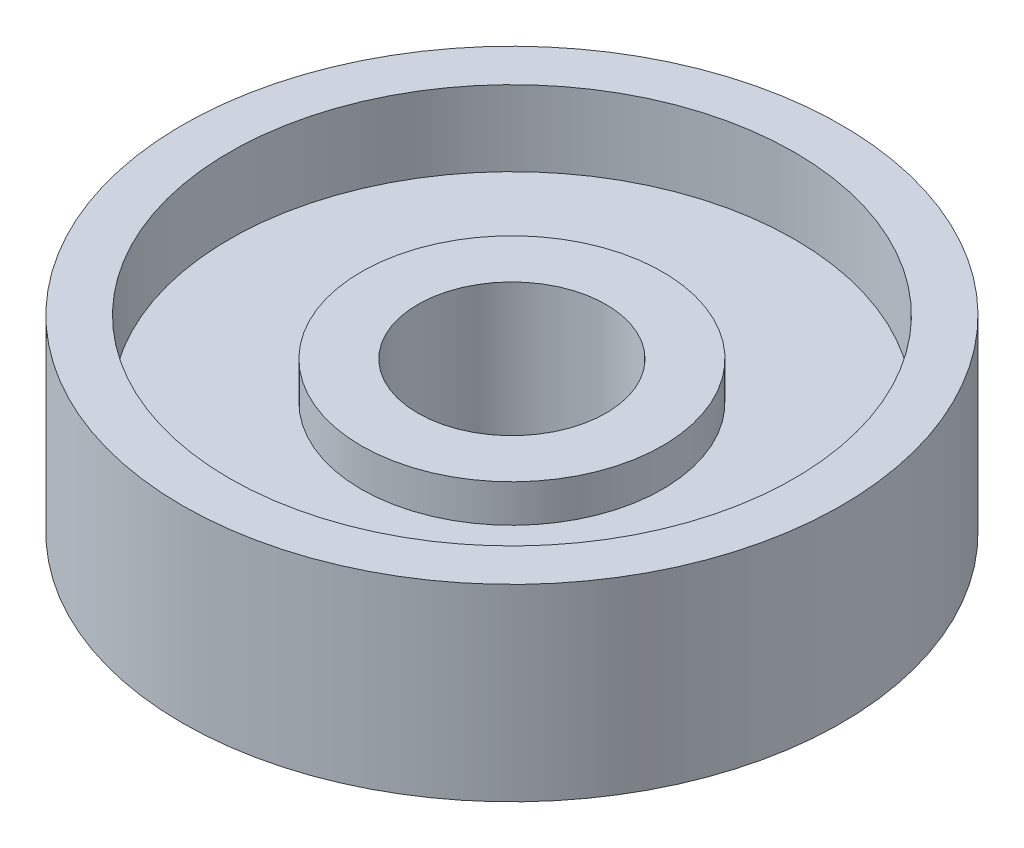
ISO-10303-21;
HEADER;
FILE_DESCRIPTION(('STEP AP214'),'2;1');
FILE_NAME('part.step','',(''),(''),'','','');
FILE_SCHEMA(('AUTOMOTIVE_DESIGN { 1 0 10303 214 1 1 1 1 }'));
ENDSEC;
DATA;
#1=APPLICATION_CONTEXT('core data for automotive mechanical design processes');
#2=APPLICATION_PROTOCOL_DEFINITION('international standard','automotive_design',2000,#1);
#3=PRODUCT_CONTEXT('',#1,'mechanical');
#4=PRODUCT('Part','Part','',(#3));
#5=PRODUCT_RELATED_PRODUCT_CATEGORY('part','',(#4));
#6=PRODUCT_DEFINITION_FORMATION('','',#4);
#7=PRODUCT_DEFINITION_CONTEXT('part definition',#1,'design');
#8=PRODUCT_DEFINITION('design','',#6,#7);
#9=PRODUCT_DEFINITION_SHAPE('','',#8);
#10=(LENGTH_UNIT() NAMED_UNIT(*) SI_UNIT(.MILLI.,.METRE.));
#11=(NAMED_UNIT(*) PLANE_ANGLE_UNIT() SI_UNIT($,.RADIAN.));
#12=(NAMED_UNIT(*) SI_UNIT($,.STERADIAN.) SOLID_ANGLE_UNIT());
#13=UNCERTAINTY_MEASURE_WITH_UNIT(LENGTH_MEASURE(1.E-05),#10,'distance_accuracy_value','');
#14=(GEOMETRIC_REPRESENTATION_CONTEXT(3) GLOBAL_UNCERTAINTY_ASSIGNED_CONTEXT((#13)) GLOBAL_UNIT_ASSIGNED_CONTEXT((#10,
#11,#12)) REPRESENTATION_CONTEXT('',''));
#15=CARTESIAN_POINT('',(0.,0.,0.));
#16=DIRECTION('',(0.,0.,1.));
#17=DIRECTION('',(1.,0.,0.));
#18=AXIS2_PLACEMENT_3D('',#15,#16,#17);
#19=CARTESIAN_POINT('',(0.,3.81,0.));
#20=DIRECTION('',(0.,1.,0.));
#21=DIRECTION('',(0.,0.,1.));
#22=AXIS2_PLACEMENT_3D('',#19,#20,#21);
#23=PLANE('',#22);
#24=CARTESIAN_POINT('',(0.,3.81,0.));
#25=DIRECTION('',(0.,1.,0.));
#26=DIRECTION('',(0.,0.,1.));
#27=AXIS2_PLACEMENT_3D('',#24,#25,#26);
#28=CIRCLE('',#27,9.525);
#29=CARTESIAN_POINT('',(0.,3.81,9.525));
#30=VERTEX_POINT('',#29);
#31=EDGE_CURVE('E57',#30,#30,#28,.T.);
#32=ORIENTED_EDGE('',*,*,#31,.T.);
#33=EDGE_LOOP('',(#32));
#34=FACE_BOUND('',#33,.T.);
#35=CARTESIAN_POINT('',(0.,3.81,0.));
#36=DIRECTION('',(0.,1.,0.));
#37=DIRECTION('',(0.,0.,1.));
#38=AXIS2_PLACEMENT_3D('',#35,#36,#37);
#39=CIRCLE('',#38,5.08);
#40=CARTESIAN_POINT('',(0.,3.81,5.08));
#41=VERTEX_POINT('',#40);
#42=EDGE_CURVE('E62',#41,#41,#39,.T.);
#43=ORIENTED_EDGE('',*,*,#42,.F.);
#44=EDGE_LOOP('',(#43));
#45=FACE_BOUND('',#44,.T.);
#46=ADVANCED_FACE('F41',(#34,#45),#23,.T.);
#47=CARTESIAN_POINT('',(0.,6.35,0.));
#48=DIRECTION('',(0.,-1.,0.));
#49=DIRECTION('',(0.,0.,-1.));
#50=AXIS2_PLACEMENT_3D('',#47,#48,#49);
#51=CYLINDRICAL_SURFACE('',#50,3.175);
#52=CARTESIAN_POINT('',(0.,0.,0.));
#53=DIRECTION('',(0.,1.,0.));
#54=DIRECTION('',(0.,0.,1.));
#55=AXIS2_PLACEMENT_3D('',#52,#53,#54);
#56=CIRCLE('',#55,3.175);
#57=CARTESIAN_POINT('',(0.,0.,3.175));
#58=VERTEX_POINT('',#57);
#59=EDGE_CURVE('E55',#58,#58,#56,.T.);
#60=ORIENTED_EDGE('',*,*,#59,.F.);
#61=EDGE_LOOP('',(#60));
#62=FACE_BOUND('',#61,.T.);
#63=CARTESIAN_POINT('',(0.,5.08,0.));
#64=DIRECTION('',(0.,1.,0.));
#65=DIRECTION('',(0.,0.,1.));
#66=AXIS2_PLACEMENT_3D('',#63,#64,#65);
#67=CIRCLE('',#66,3.175);
#68=CARTESIAN_POINT('',(0.,5.08,3.175));
#69=VERTEX_POINT('',#68);
#70=EDGE_CURVE('E68',#69,#69,#67,.T.);
#71=ORIENTED_EDGE('',*,*,#70,.T.);
#72=EDGE_LOOP('',(#71));
#73=FACE_BOUND('',#72,.T.);
#74=ADVANCED_FACE('F75',(#62,#73),#51,.F.);
#75=CARTESIAN_POINT('',(0.,6.35,0.));
#76=DIRECTION('',(0.,1.,0.));
#77=DIRECTION('',(0.,0.,1.));
#78=AXIS2_PLACEMENT_3D('',#75,#76,#77);
#79=PLANE('',#78);
#80=CARTESIAN_POINT('',(0.,6.35,0.));
#81=DIRECTION('',(0.,1.,0.));
#82=DIRECTION('',(0.,0.,1.));
#83=AXIS2_PLACEMENT_3D('',#80,#81,#82);
#84=CIRCLE('',#83,9.525);
#85=CARTESIAN_POINT('',(0.,6.35,9.525));
#86=VERTEX_POINT('',#85);
#87=EDGE_CURVE('E60',#86,#86,#84,.T.);
#88=ORIENTED_EDGE('',*,*,#87,.F.);
#89=EDGE_LOOP('',(#88));
#90=FACE_BOUND('',#89,.T.);
#91=CARTESIAN_POINT('',(0.,6.35,0.));
#92=DIRECTION('',(0.,1.,0.));
#93=DIRECTION('',(0.,0.,1.));
#94=AXIS2_PLACEMENT_3D('',#91,#92,#93);
#95=CIRCLE('',#94,11.1125);
#96=CARTESIAN_POINT('',(0.,6.35,11.1125));
#97=VERTEX_POINT('',#96);
#98=EDGE_CURVE('E10',#97,#97,#95,.T.);
#99=ORIENTED_EDGE('',*,*,#98,.T.);
#100=EDGE_LOOP('',(#99));
#101=FACE_BOUND('',#100,.T.);
#102=ADVANCED_FACE('F94',(#90,#101),#79,.T.);
#103=CARTESIAN_POINT('',(0.,0.,0.));
#104=DIRECTION('',(0.,1.,0.));
#105=DIRECTION('',(0.,0.,1.));
#106=AXIS2_PLACEMENT_3D('',#103,#104,#105);
#107=PLANE('',#106);
#108=CARTESIAN_POINT('',(0.,0.,0.));
#109=DIRECTION('',(0.,1.,0.));
#110=DIRECTION('',(0.,0.,1.));
#111=AXIS2_PLACEMENT_3D('',#108,#109,#110);
#112=CIRCLE('',#111,11.1125);
#113=CARTESIAN_POINT('',(0.,0.,11.1125));
#114=VERTEX_POINT('',#113);
#115=EDGE_CURVE('E44',#114,#114,#112,.T.);
#116=ORIENTED_EDGE('',*,*,#115,.F.);
#117=EDGE_LOOP('',(#116));
#118=FACE_BOUND('',#117,.T.);
#119=ORIENTED_EDGE('',*,*,#59,.T.);
#120=EDGE_LOOP('',(#119));
#121=FACE_BOUND('',#120,.T.);
#122=ADVANCED_FACE('F99',(#118,#121),#107,.F.);
#123=CARTESIAN_POINT('',(0.,6.35,0.));
#124=DIRECTION('',(0.,-1.,0.));
#125=DIRECTION('',(0.,0.,-1.));
#126=AXIS2_PLACEMENT_3D('',#123,#124,#125);
#127=CYLINDRICAL_SURFACE('',#126,11.1125);
#128=ORIENTED_EDGE('',*,*,#98,.F.);
#129=EDGE_LOOP('',(#128));
#130=FACE_BOUND('',#129,.T.);
#131=ORIENTED_EDGE('',*,*,#115,.T.);
#132=EDGE_LOOP('',(#131));
#133=FACE_BOUND('',#132,.T.);
#134=ADVANCED_FACE('F43',(#130,#133),#127,.T.);
#135=CARTESIAN_POINT('',(0.,3.81,0.));
#136=DIRECTION('',(0.,1.,0.));
#137=DIRECTION('',(0.,0.,1.));
#138=AXIS2_PLACEMENT_3D('',#135,#136,#137);
#139=CYLINDRICAL_SURFACE('',#138,9.525);
#140=ORIENTED_EDGE('',*,*,#31,.F.);
#141=EDGE_LOOP('',(#140));
#142=FACE_BOUND('',#141,.T.);
#143=ORIENTED_EDGE('',*,*,#87,.T.);
#144=EDGE_LOOP('',(#143));
#145=FACE_BOUND('',#144,.T.);
#146=ADVANCED_FACE('F80',(#142,#145),#139,.F.);
#147=CARTESIAN_POINT('',(0.,5.08,0.));
#148=DIRECTION('',(0.,1.,0.));
#149=DIRECTION('',(0.,0.,1.));
#150=AXIS2_PLACEMENT_3D('',#147,#148,#149);
#151=PLANE('',#150);
#152=CARTESIAN_POINT('',(0.,5.08,0.));
#153=DIRECTION('',(0.,1.,0.));
#154=DIRECTION('',(0.,0.,1.));
#155=AXIS2_PLACEMENT_3D('',#152,#153,#154);
#156=CIRCLE('',#155,5.08);
#157=CARTESIAN_POINT('',(0.,5.08,5.08));
#158=VERTEX_POINT('',#157);
#159=EDGE_CURVE('E58',#158,#158,#156,.T.);
#160=ORIENTED_EDGE('',*,*,#159,.T.);
#161=EDGE_LOOP('',(#160));
#162=FACE_BOUND('',#161,.T.);
#163=ORIENTED_EDGE('',*,*,#70,.F.);
#164=EDGE_LOOP('',(#163));
#165=FACE_BOUND('',#164,.T.);
#166=ADVANCED_FACE('F74',(#162,#165),#151,.T.);
#167=CARTESIAN_POINT('',(0.,5.08,0.));
#168=DIRECTION('',(0.,-1.,0.));
#169=DIRECTION('',(0.,0.,-1.));
#170=AXIS2_PLACEMENT_3D('',#167,#168,#169);
#171=CYLINDRICAL_SURFACE('',#170,5.08);
#172=ORIENTED_EDGE('',*,*,#159,.F.);
#173=EDGE_LOOP('',(#172));
#174=FACE_BOUND('',#173,.T.);
#175=ORIENTED_EDGE('',*,*,#42,.T.);
#176=EDGE_LOOP('',(#175));
#177=FACE_BOUND('',#176,.T.);
#178=ADVANCED_FACE('F76',(#174,#177),#171,.T.);
#179=CLOSED_SHELL('',(#46,#74,#102,#122,#134,#146,#166,#178));
#180=MANIFOLD_SOLID_BREP('B2',#179);
#181=ADVANCED_BREP_SHAPE_REPRESENTATION('',(#18,#180),#14);
#182=SHAPE_DEFINITION_REPRESENTATION(#9,#181);
ENDSEC;
END-ISO-10303-21;
